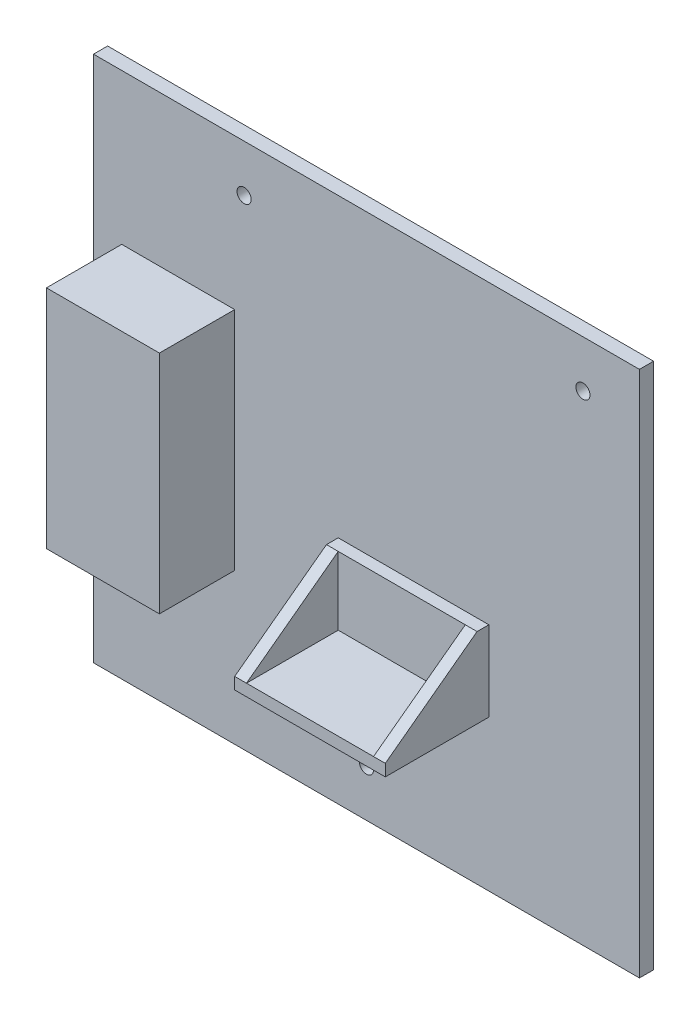
ISO-10303-21;
HEADER;
FILE_DESCRIPTION(('STEP AP214'),'2;1');
FILE_NAME('part.step','',(''),(''),'','','');
FILE_SCHEMA(('AUTOMOTIVE_DESIGN { 1 0 10303 214 1 1 1 1 }'));
ENDSEC;
DATA;
#1=APPLICATION_CONTEXT('core data for automotive mechanical design processes');
#2=APPLICATION_PROTOCOL_DEFINITION('international standard','automotive_design',2000,#1);
#3=PRODUCT_CONTEXT('',#1,'mechanical');
#4=PRODUCT('Part','Part','',(#3));
#5=PRODUCT_RELATED_PRODUCT_CATEGORY('part','',(#4));
#6=PRODUCT_DEFINITION_FORMATION('','',#4);
#7=PRODUCT_DEFINITION_CONTEXT('part definition',#1,'design');
#8=PRODUCT_DEFINITION('design','',#6,#7);
#9=PRODUCT_DEFINITION_SHAPE('','',#8);
#10=(LENGTH_UNIT() NAMED_UNIT(*) SI_UNIT(.MILLI.,.METRE.));
#11=(NAMED_UNIT(*) PLANE_ANGLE_UNIT() SI_UNIT($,.RADIAN.));
#12=(NAMED_UNIT(*) SI_UNIT($,.STERADIAN.) SOLID_ANGLE_UNIT());
#13=UNCERTAINTY_MEASURE_WITH_UNIT(LENGTH_MEASURE(1.E-05),#10,'distance_accuracy_value','');
#14=(GEOMETRIC_REPRESENTATION_CONTEXT(3) GLOBAL_UNCERTAINTY_ASSIGNED_CONTEXT((#13)) GLOBAL_UNIT_ASSIGNED_CONTEXT((#10,
#11,#12)) REPRESENTATION_CONTEXT('',''));
#15=CARTESIAN_POINT('',(0.,0.,0.));
#16=DIRECTION('',(0.,0.,1.));
#17=DIRECTION('',(1.,0.,0.));
#18=AXIS2_PLACEMENT_3D('',#15,#16,#17);
#19=CARTESIAN_POINT('',(-58.001,-21.5,25.));
#20=DIRECTION('',(0.,-0.802462340946133,-0.596702766344561));
#21=DIRECTION('',(0.,0.596702766344561,-0.802462340946133));
#22=AXIS2_PLACEMENT_3D('',#19,#20,#21);
#23=PLANE('',#22);
#24=DIRECTION('',(1.,0.,0.));
#25=VECTOR('',#24,1.);
#26=CARTESIAN_POINT('',(-58.001,-21.5,25.));
#27=LINE('',#26,#25);
#28=CARTESIAN_POINT('',(-6.00000000000001,-21.5,25.));
#29=VERTEX_POINT('',#28);
#30=CARTESIAN_POINT('',(-3.5,-21.5,25.));
#31=VERTEX_POINT('',#30);
#32=EDGE_CURVE('E184',#29,#31,#27,.T.);
#33=ORIENTED_EDGE('',*,*,#32,.T.);
#34=DIRECTION('',(0.,0.596702766344561,-0.802462340946133));
#35=VECTOR('',#34,1.);
#36=CARTESIAN_POINT('',(-3.5,-21.5,25.));
#37=LINE('',#36,#35);
#38=CARTESIAN_POINT('',(-3.50000000000001,-7.,5.5));
#39=VERTEX_POINT('',#38);
#40=EDGE_CURVE('E11',#31,#39,#37,.T.);
#41=ORIENTED_EDGE('',*,*,#40,.T.);
#42=DIRECTION('',(1.,0.,0.));
#43=VECTOR('',#42,1.);
#44=CARTESIAN_POINT('',(-58.001,-7.,5.5));
#45=LINE('',#44,#43);
#46=CARTESIAN_POINT('',(-6.00000000000001,-7.,5.5));
#47=VERTEX_POINT('',#46);
#48=EDGE_CURVE('E180',#47,#39,#45,.T.);
#49=ORIENTED_EDGE('',*,*,#48,.F.);
#50=DIRECTION('',(0.,-0.596702766344561,0.802462340946133));
#51=VECTOR('',#50,1.);
#52=CARTESIAN_POINT('',(-6.00000000000001,-21.5,25.));
#53=LINE('',#52,#51);
#54=EDGE_CURVE('E56',#47,#29,#53,.T.);
#55=ORIENTED_EDGE('',*,*,#54,.T.);
#56=EDGE_LOOP('',(#33,#41,#49,#55));
#57=FACE_BOUND('',#56,.T.);
#58=ADVANCED_FACE('F33',(#57),#23,.F.);
#59=CARTESIAN_POINT('',(0.,0.,3.));
#60=DIRECTION('',(0.,0.,-1.));
#61=DIRECTION('',(-1.,0.,0.));
#62=AXIS2_PLACEMENT_3D('',#59,#60,#61);
#63=PLANE('',#62);
#64=CARTESIAN_POINT('',(-26.,46.,3.));
#65=DIRECTION('',(0.,0.,1.));
#66=DIRECTION('',(1.,0.,0.));
#67=AXIS2_PLACEMENT_3D('',#64,#65,#66);
#68=CIRCLE('',#67,1.5);
#69=CARTESIAN_POINT('',(-24.5,46.,3.));
#70=VERTEX_POINT('',#69);
#71=EDGE_CURVE('E167',#70,#70,#68,.T.);
#72=ORIENTED_EDGE('',*,*,#71,.F.);
#73=EDGE_LOOP('',(#72));
#74=FACE_BOUND('',#73,.T.);
#75=CARTESIAN_POINT('',(46.,46.,3.));
#76=DIRECTION('',(0.,0.,1.));
#77=DIRECTION('',(1.,0.,0.));
#78=AXIS2_PLACEMENT_3D('',#75,#76,#77);
#79=CIRCLE('',#78,1.5);
#80=CARTESIAN_POINT('',(47.5,46.,3.));
#81=VERTEX_POINT('',#80);
#82=EDGE_CURVE('E363',#81,#81,#79,.T.);
#83=ORIENTED_EDGE('',*,*,#82,.F.);
#84=EDGE_LOOP('',(#83));
#85=FACE_BOUND('',#84,.T.);
#86=CARTESIAN_POINT('',(0.,-46.,3.));
#87=DIRECTION('',(0.,0.,1.));
#88=DIRECTION('',(1.,0.,0.));
#89=AXIS2_PLACEMENT_3D('',#86,#87,#88);
#90=CIRCLE('',#89,1.5);
#91=CARTESIAN_POINT('',(1.5,-46.,3.));
#92=VERTEX_POINT('',#91);
#93=EDGE_CURVE('E370',#92,#92,#90,.T.);
#94=ORIENTED_EDGE('',*,*,#93,.F.);
#95=EDGE_LOOP('',(#94));
#96=FACE_BOUND('',#95,.T.);
#97=DIRECTION('',(0.,1.,0.));
#98=VECTOR('',#97,1.);
#99=CARTESIAN_POINT('',(-28.,-24.,3.));
#100=LINE('',#99,#98);
#101=CARTESIAN_POINT('',(-28.,-24.,3.));
#102=VERTEX_POINT('',#101);
#103=CARTESIAN_POINT('',(-28.,24.,3.));
#104=VERTEX_POINT('',#103);
#105=EDGE_CURVE('E216',#102,#104,#100,.T.);
#106=ORIENTED_EDGE('',*,*,#105,.F.);
#107=DIRECTION('',(1.,0.,0.));
#108=VECTOR('',#107,1.);
#109=CARTESIAN_POINT('',(-52.,-24.,3.));
#110=LINE('',#109,#108);
#111=CARTESIAN_POINT('',(-52.,-24.,3.));
#112=VERTEX_POINT('',#111);
#113=EDGE_CURVE('E221',#112,#102,#110,.T.);
#114=ORIENTED_EDGE('',*,*,#113,.F.);
#115=DIRECTION('',(0.,-1.,0.));
#116=VECTOR('',#115,1.);
#117=CARTESIAN_POINT('',(-52.,-24.,3.));
#118=LINE('',#117,#116);
#119=CARTESIAN_POINT('',(-52.,24.,3.));
#120=VERTEX_POINT('',#119);
#121=EDGE_CURVE('E233',#120,#112,#118,.T.);
#122=ORIENTED_EDGE('',*,*,#121,.F.);
#123=DIRECTION('',(-1.,0.,0.));
#124=VECTOR('',#123,1.);
#125=CARTESIAN_POINT('',(-52.,24.,3.));
#126=LINE('',#125,#124);
#127=EDGE_CURVE('E230',#104,#120,#126,.T.);
#128=ORIENTED_EDGE('',*,*,#127,.F.);
#129=EDGE_LOOP('',(#106,#114,#122,#128));
#130=FACE_BOUND('',#129,.T.);
#131=DIRECTION('',(0.,1.,0.));
#132=VECTOR('',#131,1.);
#133=CARTESIAN_POINT('',(58.,-56.,3.));
#134=LINE('',#133,#132);
#135=CARTESIAN_POINT('',(58.,-56.,3.));
#136=VERTEX_POINT('',#135);
#137=CARTESIAN_POINT('',(58.,56.,3.));
#138=VERTEX_POINT('',#137);
#139=EDGE_CURVE('E250',#136,#138,#134,.T.);
#140=ORIENTED_EDGE('',*,*,#139,.T.);
#141=DIRECTION('',(-1.,0.,0.));
#142=VECTOR('',#141,1.);
#143=CARTESIAN_POINT('',(-58.,56.,3.));
#144=LINE('',#143,#142);
#145=CARTESIAN_POINT('',(-58.,56.,3.));
#146=VERTEX_POINT('',#145);
#147=EDGE_CURVE('E253',#138,#146,#144,.T.);
#148=ORIENTED_EDGE('',*,*,#147,.T.);
#149=DIRECTION('',(0.,-1.,0.));
#150=VECTOR('',#149,1.);
#151=CARTESIAN_POINT('',(-58.,-56.,3.));
#152=LINE('',#151,#150);
#153=CARTESIAN_POINT('',(-58.,-56.,3.));
#154=VERTEX_POINT('',#153);
#155=EDGE_CURVE('E256',#146,#154,#152,.T.);
#156=ORIENTED_EDGE('',*,*,#155,.T.);
#157=DIRECTION('',(1.,0.,0.));
#158=VECTOR('',#157,1.);
#159=CARTESIAN_POINT('',(-58.,-56.,3.));
#160=LINE('',#159,#158);
#161=EDGE_CURVE('E258',#154,#136,#160,.T.);
#162=ORIENTED_EDGE('',*,*,#161,.T.);
#163=EDGE_LOOP('',(#140,#148,#156,#162));
#164=FACE_BOUND('',#163,.T.);
#165=DIRECTION('',(0.,1.,0.));
#166=VECTOR('',#165,1.);
#167=CARTESIAN_POINT('',(26.,-24.,3.));
#168=LINE('',#167,#166);
#169=CARTESIAN_POINT('',(26.,-24.,3.));
#170=VERTEX_POINT('',#169);
#171=CARTESIAN_POINT('',(26.,-7.,3.));
#172=VERTEX_POINT('',#171);
#173=EDGE_CURVE('E187',#170,#172,#168,.T.);
#174=ORIENTED_EDGE('',*,*,#173,.F.);
#175=DIRECTION('',(1.,0.,0.));
#176=VECTOR('',#175,1.);
#177=CARTESIAN_POINT('',(-6.00000000000001,-24.,3.));
#178=LINE('',#177,#176);
#179=CARTESIAN_POINT('',(-6.00000000000001,-24.,3.));
#180=VERTEX_POINT('',#179);
#181=EDGE_CURVE('E192',#180,#170,#178,.T.);
#182=ORIENTED_EDGE('',*,*,#181,.F.);
#183=DIRECTION('',(0.,-1.,0.));
#184=VECTOR('',#183,1.);
#185=CARTESIAN_POINT('',(-6.00000000000001,-24.,3.));
#186=LINE('',#185,#184);
#187=CARTESIAN_POINT('',(-6.00000000000001,-7.,3.));
#188=VERTEX_POINT('',#187);
#189=EDGE_CURVE('E202',#188,#180,#186,.T.);
#190=ORIENTED_EDGE('',*,*,#189,.F.);
#191=DIRECTION('',(-1.,0.,0.));
#192=VECTOR('',#191,1.);
#193=CARTESIAN_POINT('',(-6.00000000000001,-7.,3.));
#194=LINE('',#193,#192);
#195=EDGE_CURVE('E199',#172,#188,#194,.T.);
#196=ORIENTED_EDGE('',*,*,#195,.F.);
#197=EDGE_LOOP('',(#174,#182,#190,#196));
#198=FACE_BOUND('',#197,.T.);
#199=ADVANCED_FACE('F297',(#74,#85,#96,#130,#164,#198),#63,.F.);
#200=CARTESIAN_POINT('',(58.,-56.,3.));
#201=DIRECTION('',(-1.,0.,0.));
#202=DIRECTION('',(0.,0.,1.));
#203=AXIS2_PLACEMENT_3D('',#200,#201,#202);
#204=PLANE('',#203);
#205=DIRECTION('',(0.,1.,0.));
#206=VECTOR('',#205,1.);
#207=CARTESIAN_POINT('',(58.,-56.,0.));
#208=LINE('',#207,#206);
#209=CARTESIAN_POINT('',(58.,-56.,0.));
#210=VERTEX_POINT('',#209);
#211=CARTESIAN_POINT('',(58.,56.,0.));
#212=VERTEX_POINT('',#211);
#213=EDGE_CURVE('E249',#210,#212,#208,.T.);
#214=ORIENTED_EDGE('',*,*,#213,.T.);
#215=DIRECTION('',(0.,0.,-1.));
#216=VECTOR('',#215,1.);
#217=CARTESIAN_POINT('',(58.,56.,3.));
#218=LINE('',#217,#216);
#219=EDGE_CURVE('E276',#138,#212,#218,.T.);
#220=ORIENTED_EDGE('',*,*,#219,.F.);
#221=ORIENTED_EDGE('',*,*,#139,.F.);
#222=DIRECTION('',(0.,0.,-1.));
#223=VECTOR('',#222,1.);
#224=CARTESIAN_POINT('',(58.,-56.,3.));
#225=LINE('',#224,#223);
#226=EDGE_CURVE('E260',#136,#210,#225,.T.);
#227=ORIENTED_EDGE('',*,*,#226,.T.);
#228=EDGE_LOOP('',(#214,#220,#221,#227));
#229=FACE_BOUND('',#228,.T.);
#230=ADVANCED_FACE('F35',(#229),#204,.F.);
#231=CARTESIAN_POINT('',(-58.,56.,3.));
#232=DIRECTION('',(0.,-1.,0.));
#233=DIRECTION('',(1.,0.,0.));
#234=AXIS2_PLACEMENT_3D('',#231,#232,#233);
#235=PLANE('',#234);
#236=DIRECTION('',(-1.,0.,0.));
#237=VECTOR('',#236,1.);
#238=CARTESIAN_POINT('',(-58.,56.,0.));
#239=LINE('',#238,#237);
#240=CARTESIAN_POINT('',(-58.,56.,0.));
#241=VERTEX_POINT('',#240);
#242=EDGE_CURVE('E263',#212,#241,#239,.T.);
#243=ORIENTED_EDGE('',*,*,#242,.T.);
#244=DIRECTION('',(0.,0.,-1.));
#245=VECTOR('',#244,1.);
#246=CARTESIAN_POINT('',(-58.,56.,3.));
#247=LINE('',#246,#245);
#248=EDGE_CURVE('E273',#146,#241,#247,.T.);
#249=ORIENTED_EDGE('',*,*,#248,.F.);
#250=ORIENTED_EDGE('',*,*,#147,.F.);
#251=ORIENTED_EDGE('',*,*,#219,.T.);
#252=EDGE_LOOP('',(#243,#249,#250,#251));
#253=FACE_BOUND('',#252,.T.);
#254=ADVANCED_FACE('F397',(#253),#235,.F.);
#255=CARTESIAN_POINT('',(-58.,-56.,3.));
#256=DIRECTION('',(1.,0.,0.));
#257=DIRECTION('',(0.,0.,-1.));
#258=AXIS2_PLACEMENT_3D('',#255,#256,#257);
#259=PLANE('',#258);
#260=DIRECTION('',(0.,-1.,0.));
#261=VECTOR('',#260,1.);
#262=CARTESIAN_POINT('',(-58.,-56.,0.));
#263=LINE('',#262,#261);
#264=CARTESIAN_POINT('',(-58.,-56.,0.));
#265=VERTEX_POINT('',#264);
#266=EDGE_CURVE('E265',#241,#265,#263,.T.);
#267=ORIENTED_EDGE('',*,*,#266,.T.);
#268=DIRECTION('',(0.,0.,-1.));
#269=VECTOR('',#268,1.);
#270=CARTESIAN_POINT('',(-58.,-56.,3.));
#271=LINE('',#270,#269);
#272=EDGE_CURVE('E270',#154,#265,#271,.T.);
#273=ORIENTED_EDGE('',*,*,#272,.F.);
#274=ORIENTED_EDGE('',*,*,#155,.F.);
#275=ORIENTED_EDGE('',*,*,#248,.T.);
#276=EDGE_LOOP('',(#267,#273,#274,#275));
#277=FACE_BOUND('',#276,.T.);
#278=ADVANCED_FACE('F394',(#277),#259,.F.);
#279=CARTESIAN_POINT('',(-58.,-56.,3.));
#280=DIRECTION('',(0.,1.,0.));
#281=DIRECTION('',(-1.,0.,0.));
#282=AXIS2_PLACEMENT_3D('',#279,#280,#281);
#283=PLANE('',#282);
#284=DIRECTION('',(1.,0.,0.));
#285=VECTOR('',#284,1.);
#286=CARTESIAN_POINT('',(-58.,-56.,0.));
#287=LINE('',#286,#285);
#288=EDGE_CURVE('E254',#265,#210,#287,.T.);
#289=ORIENTED_EDGE('',*,*,#288,.T.);
#290=ORIENTED_EDGE('',*,*,#226,.F.);
#291=ORIENTED_EDGE('',*,*,#161,.F.);
#292=ORIENTED_EDGE('',*,*,#272,.T.);
#293=EDGE_LOOP('',(#289,#290,#291,#292));
#294=FACE_BOUND('',#293,.T.);
#295=ADVANCED_FACE('F379',(#294),#283,.F.);
#296=CARTESIAN_POINT('',(0.,0.,0.));
#297=DIRECTION('',(0.,0.,-1.));
#298=DIRECTION('',(-1.,0.,0.));
#299=AXIS2_PLACEMENT_3D('',#296,#297,#298);
#300=PLANE('',#299);
#301=CARTESIAN_POINT('',(-26.,46.,0.));
#302=DIRECTION('',(0.,0.,-1.));
#303=DIRECTION('',(-1.,0.,0.));
#304=AXIS2_PLACEMENT_3D('',#301,#302,#303);
#305=CIRCLE('',#304,1.5);
#306=CARTESIAN_POINT('',(-24.5,46.,0.));
#307=VERTEX_POINT('',#306);
#308=EDGE_CURVE('E359',#307,#307,#305,.F.);
#309=ORIENTED_EDGE('',*,*,#308,.T.);
#310=EDGE_LOOP('',(#309));
#311=FACE_BOUND('',#310,.T.);
#312=CARTESIAN_POINT('',(46.,46.,0.));
#313=DIRECTION('',(0.,0.,-1.));
#314=DIRECTION('',(-1.,0.,0.));
#315=AXIS2_PLACEMENT_3D('',#312,#313,#314);
#316=CIRCLE('',#315,1.5);
#317=CARTESIAN_POINT('',(47.5,46.,0.));
#318=VERTEX_POINT('',#317);
#319=EDGE_CURVE('E368',#318,#318,#316,.F.);
#320=ORIENTED_EDGE('',*,*,#319,.T.);
#321=EDGE_LOOP('',(#320));
#322=FACE_BOUND('',#321,.T.);
#323=CARTESIAN_POINT('',(0.,-46.,0.));
#324=DIRECTION('',(0.,0.,-1.));
#325=DIRECTION('',(-1.,0.,0.));
#326=AXIS2_PLACEMENT_3D('',#323,#324,#325);
#327=CIRCLE('',#326,1.5);
#328=CARTESIAN_POINT('',(1.5,-46.,0.));
#329=VERTEX_POINT('',#328);
#330=EDGE_CURVE('E170',#329,#329,#327,.F.);
#331=ORIENTED_EDGE('',*,*,#330,.T.);
#332=EDGE_LOOP('',(#331));
#333=FACE_BOUND('',#332,.T.);
#334=ORIENTED_EDGE('',*,*,#213,.F.);
#335=ORIENTED_EDGE('',*,*,#288,.F.);
#336=ORIENTED_EDGE('',*,*,#266,.F.);
#337=ORIENTED_EDGE('',*,*,#242,.F.);
#338=EDGE_LOOP('',(#334,#335,#336,#337));
#339=FACE_BOUND('',#338,.T.);
#340=ADVANCED_FACE('F375',(#311,#322,#333,#339),#300,.T.);
#341=CARTESIAN_POINT('',(-28.,-24.,19.));
#342=DIRECTION('',(-1.,0.,0.));
#343=DIRECTION('',(0.,0.,1.));
#344=AXIS2_PLACEMENT_3D('',#341,#342,#343);
#345=PLANE('',#344);
#346=ORIENTED_EDGE('',*,*,#105,.T.);
#347=DIRECTION('',(0.,0.,-1.));
#348=VECTOR('',#347,1.);
#349=CARTESIAN_POINT('',(-28.,24.,19.));
#350=LINE('',#349,#348);
#351=CARTESIAN_POINT('',(-28.,24.,19.));
#352=VERTEX_POINT('',#351);
#353=EDGE_CURVE('E246',#352,#104,#350,.T.);
#354=ORIENTED_EDGE('',*,*,#353,.F.);
#355=DIRECTION('',(0.,1.,0.));
#356=VECTOR('',#355,1.);
#357=CARTESIAN_POINT('',(-28.,-24.,19.));
#358=LINE('',#357,#356);
#359=CARTESIAN_POINT('',(-28.,-24.,19.));
#360=VERTEX_POINT('',#359);
#361=EDGE_CURVE('E217',#360,#352,#358,.T.);
#362=ORIENTED_EDGE('',*,*,#361,.F.);
#363=DIRECTION('',(0.,0.,-1.));
#364=VECTOR('',#363,1.);
#365=CARTESIAN_POINT('',(-28.,-24.,19.));
#366=LINE('',#365,#364);
#367=EDGE_CURVE('E227',#360,#102,#366,.T.);
#368=ORIENTED_EDGE('',*,*,#367,.T.);
#369=EDGE_LOOP('',(#346,#354,#362,#368));
#370=FACE_BOUND('',#369,.T.);
#371=ADVANCED_FACE('F378',(#370),#345,.F.);
#372=CARTESIAN_POINT('',(-52.,24.,19.));
#373=DIRECTION('',(0.,-1.,0.));
#374=DIRECTION('',(1.,0.,0.));
#375=AXIS2_PLACEMENT_3D('',#372,#373,#374);
#376=PLANE('',#375);
#377=ORIENTED_EDGE('',*,*,#127,.T.);
#378=DIRECTION('',(0.,0.,-1.));
#379=VECTOR('',#378,1.);
#380=CARTESIAN_POINT('',(-52.,24.,19.));
#381=LINE('',#380,#379);
#382=CARTESIAN_POINT('',(-52.,24.,19.));
#383=VERTEX_POINT('',#382);
#384=EDGE_CURVE('E243',#383,#120,#381,.T.);
#385=ORIENTED_EDGE('',*,*,#384,.F.);
#386=DIRECTION('',(-1.,0.,0.));
#387=VECTOR('',#386,1.);
#388=CARTESIAN_POINT('',(-52.,24.,19.));
#389=LINE('',#388,#387);
#390=EDGE_CURVE('E220',#352,#383,#389,.T.);
#391=ORIENTED_EDGE('',*,*,#390,.F.);
#392=ORIENTED_EDGE('',*,*,#353,.T.);
#393=EDGE_LOOP('',(#377,#385,#391,#392));
#394=FACE_BOUND('',#393,.T.);
#395=ADVANCED_FACE('F410',(#394),#376,.F.);
#396=CARTESIAN_POINT('',(-52.,-24.,19.));
#397=DIRECTION('',(1.,0.,0.));
#398=DIRECTION('',(0.,0.,-1.));
#399=AXIS2_PLACEMENT_3D('',#396,#397,#398);
#400=PLANE('',#399);
#401=ORIENTED_EDGE('',*,*,#121,.T.);
#402=DIRECTION('',(0.,0.,-1.));
#403=VECTOR('',#402,1.);
#404=CARTESIAN_POINT('',(-52.,-24.,19.));
#405=LINE('',#404,#403);
#406=CARTESIAN_POINT('',(-52.,-24.,19.));
#407=VERTEX_POINT('',#406);
#408=EDGE_CURVE('E240',#407,#112,#405,.T.);
#409=ORIENTED_EDGE('',*,*,#408,.F.);
#410=DIRECTION('',(0.,-1.,0.));
#411=VECTOR('',#410,1.);
#412=CARTESIAN_POINT('',(-52.,-24.,19.));
#413=LINE('',#412,#411);
#414=EDGE_CURVE('E223',#383,#407,#413,.T.);
#415=ORIENTED_EDGE('',*,*,#414,.F.);
#416=ORIENTED_EDGE('',*,*,#384,.T.);
#417=EDGE_LOOP('',(#401,#409,#415,#416));
#418=FACE_BOUND('',#417,.T.);
#419=ADVANCED_FACE('F414',(#418),#400,.F.);
#420=CARTESIAN_POINT('',(-52.,-24.,19.));
#421=DIRECTION('',(0.,1.,0.));
#422=DIRECTION('',(-1.,0.,0.));
#423=AXIS2_PLACEMENT_3D('',#420,#421,#422);
#424=PLANE('',#423);
#425=ORIENTED_EDGE('',*,*,#113,.T.);
#426=ORIENTED_EDGE('',*,*,#367,.F.);
#427=DIRECTION('',(1.,0.,0.));
#428=VECTOR('',#427,1.);
#429=CARTESIAN_POINT('',(-52.,-24.,19.));
#430=LINE('',#429,#428);
#431=EDGE_CURVE('E225',#407,#360,#430,.T.);
#432=ORIENTED_EDGE('',*,*,#431,.F.);
#433=ORIENTED_EDGE('',*,*,#408,.T.);
#434=EDGE_LOOP('',(#425,#426,#432,#433));
#435=FACE_BOUND('',#434,.T.);
#436=ADVANCED_FACE('F418',(#435),#424,.F.);
#437=CARTESIAN_POINT('',(0.,0.,19.));
#438=DIRECTION('',(0.,0.,-1.));
#439=DIRECTION('',(-1.,0.,0.));
#440=AXIS2_PLACEMENT_3D('',#437,#438,#439);
#441=PLANE('',#440);
#442=ORIENTED_EDGE('',*,*,#361,.T.);
#443=ORIENTED_EDGE('',*,*,#390,.T.);
#444=ORIENTED_EDGE('',*,*,#414,.T.);
#445=ORIENTED_EDGE('',*,*,#431,.T.);
#446=EDGE_LOOP('',(#442,#443,#444,#445));
#447=FACE_BOUND('',#446,.T.);
#448=ADVANCED_FACE('F422',(#447),#441,.F.);
#449=CARTESIAN_POINT('',(26.,-24.,25.));
#450=DIRECTION('',(-1.,0.,0.));
#451=DIRECTION('',(0.,0.,1.));
#452=AXIS2_PLACEMENT_3D('',#449,#450,#451);
#453=PLANE('',#452);
#454=DIRECTION('',(0.,0.,-1.));
#455=VECTOR('',#454,1.);
#456=CARTESIAN_POINT('',(26.,-7.,25.));
#457=LINE('',#456,#455);
#458=CARTESIAN_POINT('',(26.,-7.,5.5));
#459=VERTEX_POINT('',#458);
#460=EDGE_CURVE('E214',#459,#172,#457,.T.);
#461=ORIENTED_EDGE('',*,*,#460,.F.);
#462=DIRECTION('',(0.,0.596702766344561,-0.802462340946133));
#463=VECTOR('',#462,1.);
#464=CARTESIAN_POINT('',(26.,-21.5,25.));
#465=LINE('',#464,#463);
#466=CARTESIAN_POINT('',(26.,-21.5,25.));
#467=VERTEX_POINT('',#466);
#468=EDGE_CURVE('E175',#467,#459,#465,.T.);
#469=ORIENTED_EDGE('',*,*,#468,.F.);
#470=DIRECTION('',(0.,1.,0.));
#471=VECTOR('',#470,1.);
#472=CARTESIAN_POINT('',(26.,-24.,25.));
#473=LINE('',#472,#471);
#474=CARTESIAN_POINT('',(26.,-24.,25.));
#475=VERTEX_POINT('',#474);
#476=EDGE_CURVE('E188',#475,#467,#473,.T.);
#477=ORIENTED_EDGE('',*,*,#476,.F.);
#478=DIRECTION('',(0.,0.,-1.));
#479=VECTOR('',#478,1.);
#480=CARTESIAN_POINT('',(26.,-24.,25.));
#481=LINE('',#480,#479);
#482=EDGE_CURVE('E196',#475,#170,#481,.T.);
#483=ORIENTED_EDGE('',*,*,#482,.T.);
#484=ORIENTED_EDGE('',*,*,#173,.T.);
#485=EDGE_LOOP('',(#461,#469,#477,#483,#484));
#486=FACE_BOUND('',#485,.T.);
#487=ADVANCED_FACE('F290',(#486),#453,.F.);
#488=CARTESIAN_POINT('',(-6.00000000000001,-7.,25.));
#489=DIRECTION('',(0.,-1.,0.));
#490=DIRECTION('',(0.,0.,-1.));
#491=AXIS2_PLACEMENT_3D('',#488,#489,#490);
#492=PLANE('',#491);
#493=DIRECTION('',(0.,0.,-1.));
#494=VECTOR('',#493,1.);
#495=CARTESIAN_POINT('',(-6.00000000000001,-7.,25.));
#496=LINE('',#495,#494);
#497=EDGE_CURVE('E212',#47,#188,#496,.T.);
#498=ORIENTED_EDGE('',*,*,#497,.F.);
#499=ORIENTED_EDGE('',*,*,#48,.T.);
#500=DIRECTION('',(-1.,0.,0.));
#501=VECTOR('',#500,1.);
#502=CARTESIAN_POINT('',(-3.50000000000001,-7.,5.5));
#503=LINE('',#502,#501);
#504=CARTESIAN_POINT('',(23.5,-7.,5.5));
#505=VERTEX_POINT('',#504);
#506=EDGE_CURVE('E162',#505,#39,#503,.T.);
#507=ORIENTED_EDGE('',*,*,#506,.F.);
#508=EDGE_CURVE('E183',#505,#459,#45,.T.);
#509=ORIENTED_EDGE('',*,*,#508,.T.);
#510=ORIENTED_EDGE('',*,*,#460,.T.);
#511=ORIENTED_EDGE('',*,*,#195,.T.);
#512=EDGE_LOOP('',(#498,#499,#507,#509,#510,#511));
#513=FACE_BOUND('',#512,.T.);
#514=ADVANCED_FACE('F294',(#513),#492,.F.);
#515=CARTESIAN_POINT('',(-6.00000000000001,-24.,25.));
#516=DIRECTION('',(1.,0.,0.));
#517=DIRECTION('',(0.,0.,-1.));
#518=AXIS2_PLACEMENT_3D('',#515,#516,#517);
#519=PLANE('',#518);
#520=DIRECTION('',(0.,-1.,0.));
#521=VECTOR('',#520,1.);
#522=CARTESIAN_POINT('',(-6.00000000000001,-24.,25.));
#523=LINE('',#522,#521);
#524=CARTESIAN_POINT('',(-6.00000000000001,-24.,25.));
#525=VERTEX_POINT('',#524);
#526=EDGE_CURVE('E191',#29,#525,#523,.T.);
#527=ORIENTED_EDGE('',*,*,#526,.F.);
#528=ORIENTED_EDGE('',*,*,#54,.F.);
#529=ORIENTED_EDGE('',*,*,#497,.T.);
#530=ORIENTED_EDGE('',*,*,#189,.T.);
#531=DIRECTION('',(0.,0.,-1.));
#532=VECTOR('',#531,1.);
#533=CARTESIAN_POINT('',(-6.00000000000001,-24.,25.));
#534=LINE('',#533,#532);
#535=EDGE_CURVE('E209',#525,#180,#534,.T.);
#536=ORIENTED_EDGE('',*,*,#535,.F.);
#537=EDGE_LOOP('',(#527,#528,#529,#530,#536));
#538=FACE_BOUND('',#537,.T.);
#539=ADVANCED_FACE('F301',(#538),#519,.F.);
#540=CARTESIAN_POINT('',(-6.00000000000001,-24.,25.));
#541=DIRECTION('',(0.,1.,0.));
#542=DIRECTION('',(0.,0.,1.));
#543=AXIS2_PLACEMENT_3D('',#540,#541,#542);
#544=PLANE('',#543);
#545=ORIENTED_EDGE('',*,*,#181,.T.);
#546=ORIENTED_EDGE('',*,*,#482,.F.);
#547=DIRECTION('',(1.,0.,0.));
#548=VECTOR('',#547,1.);
#549=CARTESIAN_POINT('',(-6.00000000000001,-24.,25.));
#550=LINE('',#549,#548);
#551=EDGE_CURVE('E194',#525,#475,#550,.T.);
#552=ORIENTED_EDGE('',*,*,#551,.F.);
#553=ORIENTED_EDGE('',*,*,#535,.T.);
#554=EDGE_LOOP('',(#545,#546,#552,#553));
#555=FACE_BOUND('',#554,.T.);
#556=ADVANCED_FACE('F303',(#555),#544,.F.);
#557=CARTESIAN_POINT('',(0.,0.,25.));
#558=DIRECTION('',(0.,0.,-1.));
#559=DIRECTION('',(-1.,0.,0.));
#560=AXIS2_PLACEMENT_3D('',#557,#558,#559);
#561=PLANE('',#560);
#562=ORIENTED_EDGE('',*,*,#476,.T.);
#563=CARTESIAN_POINT('',(23.5,-21.5,25.));
#564=VERTEX_POINT('',#563);
#565=EDGE_CURVE('E179',#564,#467,#27,.T.);
#566=ORIENTED_EDGE('',*,*,#565,.F.);
#567=DIRECTION('',(1.,0.,0.));
#568=VECTOR('',#567,1.);
#569=CARTESIAN_POINT('',(23.5,-21.5,25.));
#570=LINE('',#569,#568);
#571=EDGE_CURVE('E152',#31,#564,#570,.T.);
#572=ORIENTED_EDGE('',*,*,#571,.F.);
#573=ORIENTED_EDGE('',*,*,#32,.F.);
#574=ORIENTED_EDGE('',*,*,#526,.T.);
#575=ORIENTED_EDGE('',*,*,#551,.T.);
#576=EDGE_LOOP('',(#562,#566,#572,#573,#574,#575));
#577=FACE_BOUND('',#576,.T.);
#578=ADVANCED_FACE('F284',(#577),#561,.F.);
#579=ORIENTED_EDGE('',*,*,#508,.F.);
#580=DIRECTION('',(0.,-0.596702766344561,0.802462340946133));
#581=VECTOR('',#580,1.);
#582=CARTESIAN_POINT('',(23.5,-21.5,25.));
#583=LINE('',#582,#581);
#584=EDGE_CURVE('E41',#505,#564,#583,.T.);
#585=ORIENTED_EDGE('',*,*,#584,.T.);
#586=ORIENTED_EDGE('',*,*,#565,.T.);
#587=ORIENTED_EDGE('',*,*,#468,.T.);
#588=EDGE_LOOP('',(#579,#585,#586,#587));
#589=FACE_BOUND('',#588,.T.);
#590=ADVANCED_FACE('F280',(#589),#23,.F.);
#591=CARTESIAN_POINT('',(-3.50000000000001,-7.,5.5));
#592=DIRECTION('',(-1.,0.,0.));
#593=DIRECTION('',(0.,0.,1.));
#594=AXIS2_PLACEMENT_3D('',#591,#592,#593);
#595=PLANE('',#594);
#596=DIRECTION('',(0.,0.,1.));
#597=VECTOR('',#596,1.);
#598=CARTESIAN_POINT('',(-3.50000000000001,-21.5,5.5));
#599=LINE('',#598,#597);
#600=CARTESIAN_POINT('',(-3.50000000000001,-21.5,5.5));
#601=VERTEX_POINT('',#600);
#602=EDGE_CURVE('E48',#601,#31,#599,.T.);
#603=ORIENTED_EDGE('',*,*,#602,.F.);
#604=DIRECTION('',(0.,-1.,0.));
#605=VECTOR('',#604,1.);
#606=CARTESIAN_POINT('',(-3.50000000000001,-7.,5.5));
#607=LINE('',#606,#605);
#608=EDGE_CURVE('E155',#39,#601,#607,.T.);
#609=ORIENTED_EDGE('',*,*,#608,.F.);
#610=ORIENTED_EDGE('',*,*,#40,.F.);
#611=EDGE_LOOP('',(#603,#609,#610));
#612=FACE_BOUND('',#611,.T.);
#613=ADVANCED_FACE('F321',(#612),#595,.F.);
#614=CARTESIAN_POINT('',(23.5,-21.5,5.5));
#615=DIRECTION('',(1.,0.,0.));
#616=DIRECTION('',(0.,0.,-1.));
#617=AXIS2_PLACEMENT_3D('',#614,#615,#616);
#618=PLANE('',#617);
#619=DIRECTION('',(0.,1.,0.));
#620=VECTOR('',#619,1.);
#621=CARTESIAN_POINT('',(23.5,-21.5,5.5));
#622=LINE('',#621,#620);
#623=CARTESIAN_POINT('',(23.5,-21.5,5.5));
#624=VERTEX_POINT('',#623);
#625=EDGE_CURVE('E158',#624,#505,#622,.T.);
#626=ORIENTED_EDGE('',*,*,#625,.F.);
#627=DIRECTION('',(0.,0.,1.));
#628=VECTOR('',#627,1.);
#629=CARTESIAN_POINT('',(23.5,-21.5,5.5));
#630=LINE('',#629,#628);
#631=EDGE_CURVE('E145',#624,#564,#630,.T.);
#632=ORIENTED_EDGE('',*,*,#631,.T.);
#633=ORIENTED_EDGE('',*,*,#584,.F.);
#634=EDGE_LOOP('',(#626,#632,#633));
#635=FACE_BOUND('',#634,.T.);
#636=ADVANCED_FACE('F159',(#635),#618,.F.);
#637=CARTESIAN_POINT('',(23.5,-21.5,5.5));
#638=DIRECTION('',(0.,-1.,0.));
#639=DIRECTION('',(0.,0.,-1.));
#640=AXIS2_PLACEMENT_3D('',#637,#638,#639);
#641=PLANE('',#640);
#642=ORIENTED_EDGE('',*,*,#571,.T.);
#643=ORIENTED_EDGE('',*,*,#631,.F.);
#644=DIRECTION('',(1.,0.,0.));
#645=VECTOR('',#644,1.);
#646=CARTESIAN_POINT('',(23.5,-21.5,5.5));
#647=LINE('',#646,#645);
#648=EDGE_CURVE('E149',#601,#624,#647,.T.);
#649=ORIENTED_EDGE('',*,*,#648,.F.);
#650=ORIENTED_EDGE('',*,*,#602,.T.);
#651=EDGE_LOOP('',(#642,#643,#649,#650));
#652=FACE_BOUND('',#651,.T.);
#653=ADVANCED_FACE('F147',(#652),#641,.F.);
#654=CARTESIAN_POINT('',(0.,0.,5.5));
#655=DIRECTION('',(0.,0.,1.));
#656=DIRECTION('',(1.,0.,0.));
#657=AXIS2_PLACEMENT_3D('',#654,#655,#656);
#658=PLANE('',#657);
#659=ORIENTED_EDGE('',*,*,#648,.T.);
#660=ORIENTED_EDGE('',*,*,#625,.T.);
#661=ORIENTED_EDGE('',*,*,#506,.T.);
#662=ORIENTED_EDGE('',*,*,#608,.T.);
#663=EDGE_LOOP('',(#659,#660,#661,#662));
#664=FACE_BOUND('',#663,.T.);
#665=ADVANCED_FACE('F164',(#664),#658,.T.);
#666=CARTESIAN_POINT('',(0.,-46.,-0.00100000000000013));
#667=DIRECTION('',(0.,0.,1.));
#668=DIRECTION('',(1.,0.,0.));
#669=AXIS2_PLACEMENT_3D('',#666,#667,#668);
#670=CYLINDRICAL_SURFACE('',#669,1.5);
#671=CARTESIAN_POINT('',(1.5,-46.,0.));
#672=CARTESIAN_POINT('',(1.5,-46.,0.03125));
#673=CARTESIAN_POINT('',(1.5,-46.,0.0625));
#674=CARTESIAN_POINT('',(1.5,-46.,0.125));
#675=CARTESIAN_POINT('',(1.5,-46.,0.15625));
#676=CARTESIAN_POINT('',(1.5,-46.,0.21875));
#677=CARTESIAN_POINT('',(1.5,-46.,0.25));
#678=CARTESIAN_POINT('',(1.5,-46.,0.3125));
#679=CARTESIAN_POINT('',(1.5,-46.,0.34375));
#680=CARTESIAN_POINT('',(1.5,-46.,0.40625));
#681=CARTESIAN_POINT('',(1.5,-46.,0.4375));
#682=CARTESIAN_POINT('',(1.5,-46.,0.5));
#683=CARTESIAN_POINT('',(1.5,-46.,0.53125));
#684=CARTESIAN_POINT('',(1.5,-46.,0.59375));
#685=CARTESIAN_POINT('',(1.5,-46.,0.625));
#686=CARTESIAN_POINT('',(1.5,-46.,0.6875));
#687=CARTESIAN_POINT('',(1.5,-46.,0.71875));
#688=CARTESIAN_POINT('',(1.5,-46.,0.78125));
#689=CARTESIAN_POINT('',(1.5,-46.,0.8125));
#690=CARTESIAN_POINT('',(1.5,-46.,0.875));
#691=CARTESIAN_POINT('',(1.5,-46.,0.90625));
#692=CARTESIAN_POINT('',(1.5,-46.,0.96875));
#693=CARTESIAN_POINT('',(1.5,-46.,1.));
#694=CARTESIAN_POINT('',(1.5,-46.,1.0625));
#695=CARTESIAN_POINT('',(1.5,-46.,1.09375));
#696=CARTESIAN_POINT('',(1.5,-46.,1.15625));
#697=CARTESIAN_POINT('',(1.5,-46.,1.1875));
#698=CARTESIAN_POINT('',(1.5,-46.,1.25));
#699=CARTESIAN_POINT('',(1.5,-46.,1.28125));
#700=CARTESIAN_POINT('',(1.5,-46.,1.34375));
#701=CARTESIAN_POINT('',(1.5,-46.,1.375));
#702=CARTESIAN_POINT('',(1.5,-46.,1.4375));
#703=CARTESIAN_POINT('',(1.5,-46.,1.46875));
#704=CARTESIAN_POINT('',(1.5,-46.,1.53125));
#705=CARTESIAN_POINT('',(1.5,-46.,1.5625));
#706=CARTESIAN_POINT('',(1.5,-46.,1.625));
#707=CARTESIAN_POINT('',(1.5,-46.,1.65625));
#708=CARTESIAN_POINT('',(1.5,-46.,1.71875));
#709=CARTESIAN_POINT('',(1.5,-46.,1.75));
#710=CARTESIAN_POINT('',(1.5,-46.,1.8125));
#711=CARTESIAN_POINT('',(1.5,-46.,1.84375));
#712=CARTESIAN_POINT('',(1.5,-46.,1.90625));
#713=CARTESIAN_POINT('',(1.5,-46.,1.9375));
#714=CARTESIAN_POINT('',(1.5,-46.,2.));
#715=CARTESIAN_POINT('',(1.5,-46.,2.03125));
#716=CARTESIAN_POINT('',(1.5,-46.,2.09375));
#717=CARTESIAN_POINT('',(1.5,-46.,2.125));
#718=CARTESIAN_POINT('',(1.5,-46.,2.1875));
#719=CARTESIAN_POINT('',(1.5,-46.,2.21875));
#720=CARTESIAN_POINT('',(1.5,-46.,2.28125));
#721=CARTESIAN_POINT('',(1.5,-46.,2.3125));
#722=CARTESIAN_POINT('',(1.5,-46.,2.375));
#723=CARTESIAN_POINT('',(1.5,-46.,2.40625));
#724=CARTESIAN_POINT('',(1.5,-46.,2.46875));
#725=CARTESIAN_POINT('',(1.5,-46.,2.5));
#726=CARTESIAN_POINT('',(1.5,-46.,2.5625));
#727=CARTESIAN_POINT('',(1.5,-46.,2.59375));
#728=CARTESIAN_POINT('',(1.5,-46.,2.65625));
#729=CARTESIAN_POINT('',(1.5,-46.,2.6875));
#730=CARTESIAN_POINT('',(1.5,-46.,2.75));
#731=CARTESIAN_POINT('',(1.5,-46.,2.78125));
#732=CARTESIAN_POINT('',(1.5,-46.,2.84375));
#733=CARTESIAN_POINT('',(1.5,-46.,2.875));
#734=CARTESIAN_POINT('',(1.5,-46.,2.9375));
#735=CARTESIAN_POINT('',(1.5,-46.,2.96875));
#736=CARTESIAN_POINT('',(1.5,-46.,3.));
#737=B_SPLINE_CURVE_WITH_KNOTS('',3,(#671,#672,#673,#674,#675,#676,#677,#678,#679,#680,#681,
#682,#683,#684,#685,#686,#687,#688,#689,#690,#691,#692,#693,#694,#695,#696,#697,#698,#699,#700,
#701,#702,#703,#704,#705,#706,#707,#708,#709,#710,#711,#712,#713,#714,#715,#716,#717,#718,#719,
#720,#721,#722,#723,#724,#725,#726,#727,#728,#729,#730,#731,#732,#733,#734,#735,#736),
.UNSPECIFIED.,.F.,.F.,(4,2,2,2,2,2,2,2,2,2,2,2,2,2,2,2,2,2,2,2,2,2,2,2,2,2,2,2,2,2,2,2,4),(0.,
0.09375,0.1875,0.28125,0.375,0.46875,0.5625,0.65625,0.75,0.84375,0.9375,1.03125,1.125,1.21875,
1.3125,1.40625,1.5,1.59375,1.6875,1.78125,1.875,1.96875,2.0625,2.15625,2.25,2.34375,2.4375,
2.53125,2.625,2.71875,2.8125,2.90625,3.),.UNSPECIFIED.);
#738=EDGE_CURVE('BSEAM337',#329,#92,#737,.T.);
#739=ORIENTED_EDGE('',*,*,#330,.F.);
#740=ORIENTED_EDGE('',*,*,#93,.T.);
#741=ORIENTED_EDGE('',*,*,#738,.T.);
#742=ORIENTED_EDGE('',*,*,#738,.F.);
#743=EDGE_LOOP('',(#739,#741,#740,#742));
#744=FACE_BOUND('',#743,.T.);
#745=ADVANCED_FACE('F337',(#744),#670,.F.);
#746=CARTESIAN_POINT('',(46.,46.,-0.00100000000000013));
#747=DIRECTION('',(0.,0.,1.));
#748=DIRECTION('',(1.,0.,0.));
#749=AXIS2_PLACEMENT_3D('',#746,#747,#748);
#750=CYLINDRICAL_SURFACE('',#749,1.5);
#751=CARTESIAN_POINT('',(47.5,46.,0.));
#752=CARTESIAN_POINT('',(47.5,46.,0.03125));
#753=CARTESIAN_POINT('',(47.5,46.,0.0625));
#754=CARTESIAN_POINT('',(47.5,46.,0.125));
#755=CARTESIAN_POINT('',(47.5,46.,0.15625));
#756=CARTESIAN_POINT('',(47.5,46.,0.21875));
#757=CARTESIAN_POINT('',(47.5,46.,0.25));
#758=CARTESIAN_POINT('',(47.5,46.,0.3125));
#759=CARTESIAN_POINT('',(47.5,46.,0.34375));
#760=CARTESIAN_POINT('',(47.5,46.,0.40625));
#761=CARTESIAN_POINT('',(47.5,46.,0.4375));
#762=CARTESIAN_POINT('',(47.5,46.,0.5));
#763=CARTESIAN_POINT('',(47.5,46.,0.53125));
#764=CARTESIAN_POINT('',(47.5,46.,0.59375));
#765=CARTESIAN_POINT('',(47.5,46.,0.625));
#766=CARTESIAN_POINT('',(47.5,46.,0.6875));
#767=CARTESIAN_POINT('',(47.5,46.,0.71875));
#768=CARTESIAN_POINT('',(47.5,46.,0.78125));
#769=CARTESIAN_POINT('',(47.5,46.,0.8125));
#770=CARTESIAN_POINT('',(47.5,46.,0.875));
#771=CARTESIAN_POINT('',(47.5,46.,0.90625));
#772=CARTESIAN_POINT('',(47.5,46.,0.96875));
#773=CARTESIAN_POINT('',(47.5,46.,1.));
#774=CARTESIAN_POINT('',(47.5,46.,1.0625));
#775=CARTESIAN_POINT('',(47.5,46.,1.09375));
#776=CARTESIAN_POINT('',(47.5,46.,1.15625));
#777=CARTESIAN_POINT('',(47.5,46.,1.1875));
#778=CARTESIAN_POINT('',(47.5,46.,1.25));
#779=CARTESIAN_POINT('',(47.5,46.,1.28125));
#780=CARTESIAN_POINT('',(47.5,46.,1.34375));
#781=CARTESIAN_POINT('',(47.5,46.,1.375));
#782=CARTESIAN_POINT('',(47.5,46.,1.4375));
#783=CARTESIAN_POINT('',(47.5,46.,1.46875));
#784=CARTESIAN_POINT('',(47.5,46.,1.53125));
#785=CARTESIAN_POINT('',(47.5,46.,1.5625));
#786=CARTESIAN_POINT('',(47.5,46.,1.625));
#787=CARTESIAN_POINT('',(47.5,46.,1.65625));
#788=CARTESIAN_POINT('',(47.5,46.,1.71875));
#789=CARTESIAN_POINT('',(47.5,46.,1.75));
#790=CARTESIAN_POINT('',(47.5,46.,1.8125));
#791=CARTESIAN_POINT('',(47.5,46.,1.84375));
#792=CARTESIAN_POINT('',(47.5,46.,1.90625));
#793=CARTESIAN_POINT('',(47.5,46.,1.9375));
#794=CARTESIAN_POINT('',(47.5,46.,2.));
#795=CARTESIAN_POINT('',(47.5,46.,2.03125));
#796=CARTESIAN_POINT('',(47.5,46.,2.09375));
#797=CARTESIAN_POINT('',(47.5,46.,2.125));
#798=CARTESIAN_POINT('',(47.5,46.,2.1875));
#799=CARTESIAN_POINT('',(47.5,46.,2.21875));
#800=CARTESIAN_POINT('',(47.5,46.,2.28125));
#801=CARTESIAN_POINT('',(47.5,46.,2.3125));
#802=CARTESIAN_POINT('',(47.5,46.,2.375));
#803=CARTESIAN_POINT('',(47.5,46.,2.40625));
#804=CARTESIAN_POINT('',(47.5,46.,2.46875));
#805=CARTESIAN_POINT('',(47.5,46.,2.5));
#806=CARTESIAN_POINT('',(47.5,46.,2.5625));
#807=CARTESIAN_POINT('',(47.5,46.,2.59375));
#808=CARTESIAN_POINT('',(47.5,46.,2.65625));
#809=CARTESIAN_POINT('',(47.5,46.,2.6875));
#810=CARTESIAN_POINT('',(47.5,46.,2.75));
#811=CARTESIAN_POINT('',(47.5,46.,2.78125));
#812=CARTESIAN_POINT('',(47.5,46.,2.84375));
#813=CARTESIAN_POINT('',(47.5,46.,2.875));
#814=CARTESIAN_POINT('',(47.5,46.,2.9375));
#815=CARTESIAN_POINT('',(47.5,46.,2.96875));
#816=CARTESIAN_POINT('',(47.5,46.,3.));
#817=B_SPLINE_CURVE_WITH_KNOTS('',3,(#751,#752,#753,#754,#755,#756,#757,#758,#759,#760,#761,
#762,#763,#764,#765,#766,#767,#768,#769,#770,#771,#772,#773,#774,#775,#776,#777,#778,#779,#780,
#781,#782,#783,#784,#785,#786,#787,#788,#789,#790,#791,#792,#793,#794,#795,#796,#797,#798,#799,
#800,#801,#802,#803,#804,#805,#806,#807,#808,#809,#810,#811,#812,#813,#814,#815,#816),
.UNSPECIFIED.,.F.,.F.,(4,2,2,2,2,2,2,2,2,2,2,2,2,2,2,2,2,2,2,2,2,2,2,2,2,2,2,2,2,2,2,2,4),(0.,
0.09375,0.1875,0.28125,0.375,0.46875,0.5625,0.65625,0.75,0.84375,0.9375,1.03125,1.125,1.21875,
1.3125,1.40625,1.5,1.59375,1.6875,1.78125,1.875,1.96875,2.0625,2.15625,2.25,2.34375,2.4375,
2.53125,2.625,2.71875,2.8125,2.90625,3.),.UNSPECIFIED.);
#818=EDGE_CURVE('BSEAM341',#318,#81,#817,.T.);
#819=ORIENTED_EDGE('',*,*,#319,.F.);
#820=ORIENTED_EDGE('',*,*,#82,.T.);
#821=ORIENTED_EDGE('',*,*,#818,.T.);
#822=ORIENTED_EDGE('',*,*,#818,.F.);
#823=EDGE_LOOP('',(#819,#821,#820,#822));
#824=FACE_BOUND('',#823,.T.);
#825=ADVANCED_FACE('F341',(#824),#750,.F.);
#826=CARTESIAN_POINT('',(-26.,46.,-0.00100000000000013));
#827=DIRECTION('',(0.,0.,1.));
#828=DIRECTION('',(1.,0.,0.));
#829=AXIS2_PLACEMENT_3D('',#826,#827,#828);
#830=CYLINDRICAL_SURFACE('',#829,1.5);
#831=CARTESIAN_POINT('',(-24.5,46.,0.));
#832=CARTESIAN_POINT('',(-24.5,46.,0.03125));
#833=CARTESIAN_POINT('',(-24.5,46.,0.0625));
#834=CARTESIAN_POINT('',(-24.5,46.,0.125));
#835=CARTESIAN_POINT('',(-24.5,46.,0.15625));
#836=CARTESIAN_POINT('',(-24.5,46.,0.21875));
#837=CARTESIAN_POINT('',(-24.5,46.,0.25));
#838=CARTESIAN_POINT('',(-24.5,46.,0.3125));
#839=CARTESIAN_POINT('',(-24.5,46.,0.34375));
#840=CARTESIAN_POINT('',(-24.5,46.,0.40625));
#841=CARTESIAN_POINT('',(-24.5,46.,0.4375));
#842=CARTESIAN_POINT('',(-24.5,46.,0.5));
#843=CARTESIAN_POINT('',(-24.5,46.,0.53125));
#844=CARTESIAN_POINT('',(-24.5,46.,0.59375));
#845=CARTESIAN_POINT('',(-24.5,46.,0.625));
#846=CARTESIAN_POINT('',(-24.5,46.,0.6875));
#847=CARTESIAN_POINT('',(-24.5,46.,0.71875));
#848=CARTESIAN_POINT('',(-24.5,46.,0.78125));
#849=CARTESIAN_POINT('',(-24.5,46.,0.8125));
#850=CARTESIAN_POINT('',(-24.5,46.,0.875));
#851=CARTESIAN_POINT('',(-24.5,46.,0.90625));
#852=CARTESIAN_POINT('',(-24.5,46.,0.96875));
#853=CARTESIAN_POINT('',(-24.5,46.,1.));
#854=CARTESIAN_POINT('',(-24.5,46.,1.0625));
#855=CARTESIAN_POINT('',(-24.5,46.,1.09375));
#856=CARTESIAN_POINT('',(-24.5,46.,1.15625));
#857=CARTESIAN_POINT('',(-24.5,46.,1.1875));
#858=CARTESIAN_POINT('',(-24.5,46.,1.25));
#859=CARTESIAN_POINT('',(-24.5,46.,1.28125));
#860=CARTESIAN_POINT('',(-24.5,46.,1.34375));
#861=CARTESIAN_POINT('',(-24.5,46.,1.375));
#862=CARTESIAN_POINT('',(-24.5,46.,1.4375));
#863=CARTESIAN_POINT('',(-24.5,46.,1.46875));
#864=CARTESIAN_POINT('',(-24.5,46.,1.53125));
#865=CARTESIAN_POINT('',(-24.5,46.,1.5625));
#866=CARTESIAN_POINT('',(-24.5,46.,1.625));
#867=CARTESIAN_POINT('',(-24.5,46.,1.65625));
#868=CARTESIAN_POINT('',(-24.5,46.,1.71875));
#869=CARTESIAN_POINT('',(-24.5,46.,1.75));
#870=CARTESIAN_POINT('',(-24.5,46.,1.8125));
#871=CARTESIAN_POINT('',(-24.5,46.,1.84375));
#872=CARTESIAN_POINT('',(-24.5,46.,1.90625));
#873=CARTESIAN_POINT('',(-24.5,46.,1.9375));
#874=CARTESIAN_POINT('',(-24.5,46.,2.));
#875=CARTESIAN_POINT('',(-24.5,46.,2.03125));
#876=CARTESIAN_POINT('',(-24.5,46.,2.09375));
#877=CARTESIAN_POINT('',(-24.5,46.,2.125));
#878=CARTESIAN_POINT('',(-24.5,46.,2.1875));
#879=CARTESIAN_POINT('',(-24.5,46.,2.21875));
#880=CARTESIAN_POINT('',(-24.5,46.,2.28125));
#881=CARTESIAN_POINT('',(-24.5,46.,2.3125));
#882=CARTESIAN_POINT('',(-24.5,46.,2.375));
#883=CARTESIAN_POINT('',(-24.5,46.,2.40625));
#884=CARTESIAN_POINT('',(-24.5,46.,2.46875));
#885=CARTESIAN_POINT('',(-24.5,46.,2.5));
#886=CARTESIAN_POINT('',(-24.5,46.,2.5625));
#887=CARTESIAN_POINT('',(-24.5,46.,2.59375));
#888=CARTESIAN_POINT('',(-24.5,46.,2.65625));
#889=CARTESIAN_POINT('',(-24.5,46.,2.6875));
#890=CARTESIAN_POINT('',(-24.5,46.,2.75));
#891=CARTESIAN_POINT('',(-24.5,46.,2.78125));
#892=CARTESIAN_POINT('',(-24.5,46.,2.84375));
#893=CARTESIAN_POINT('',(-24.5,46.,2.875));
#894=CARTESIAN_POINT('',(-24.5,46.,2.9375));
#895=CARTESIAN_POINT('',(-24.5,46.,2.96875));
#896=CARTESIAN_POINT('',(-24.5,46.,3.));
#897=B_SPLINE_CURVE_WITH_KNOTS('',3,(#831,#832,#833,#834,#835,#836,#837,#838,#839,#840,#841,
#842,#843,#844,#845,#846,#847,#848,#849,#850,#851,#852,#853,#854,#855,#856,#857,#858,#859,#860,
#861,#862,#863,#864,#865,#866,#867,#868,#869,#870,#871,#872,#873,#874,#875,#876,#877,#878,#879,
#880,#881,#882,#883,#884,#885,#886,#887,#888,#889,#890,#891,#892,#893,#894,#895,#896),
.UNSPECIFIED.,.F.,.F.,(4,2,2,2,2,2,2,2,2,2,2,2,2,2,2,2,2,2,2,2,2,2,2,2,2,2,2,2,2,2,2,2,4),(0.,
0.09375,0.1875,0.28125,0.375,0.46875,0.5625,0.65625,0.75,0.84375,0.9375,1.03125,1.125,1.21875,
1.3125,1.40625,1.5,1.59375,1.6875,1.78125,1.875,1.96875,2.0625,2.15625,2.25,2.34375,2.4375,
2.53125,2.625,2.71875,2.8125,2.90625,3.),.UNSPECIFIED.);
#898=EDGE_CURVE('BSEAM346',#307,#70,#897,.T.);
#899=ORIENTED_EDGE('',*,*,#308,.F.);
#900=ORIENTED_EDGE('',*,*,#71,.T.);
#901=ORIENTED_EDGE('',*,*,#898,.T.);
#902=ORIENTED_EDGE('',*,*,#898,.F.);
#903=EDGE_LOOP('',(#899,#901,#900,#902));
#904=FACE_BOUND('',#903,.T.);
#905=ADVANCED_FACE('F346',(#904),#830,.F.);
#906=CLOSED_SHELL('',(#58,#199,#230,#254,#278,#295,#340,#371,#395,#419,#436,#448,#487,#514,#539,
#556,#578,#590,#613,#636,#653,#665,#745,#825,#905));
#907=MANIFOLD_SOLID_BREP('B2',#906);
#908=ADVANCED_BREP_SHAPE_REPRESENTATION('',(#18,#907),#14);
#909=SHAPE_DEFINITION_REPRESENTATION(#9,#908);
ENDSEC;
END-ISO-10303-21;
